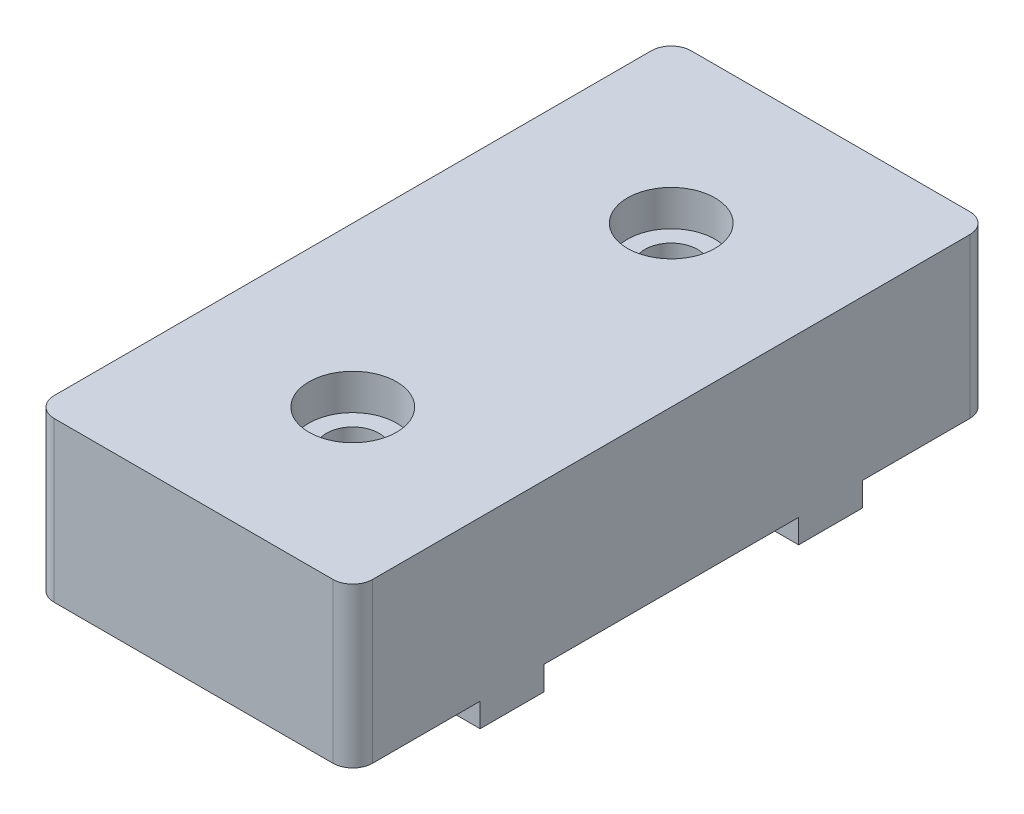
ISO-10303-21;
HEADER;
FILE_DESCRIPTION(('STEP AP214'),'2;1');
FILE_NAME('part.step','',(''),(''),'','','');
FILE_SCHEMA(('AUTOMOTIVE_DESIGN { 1 0 10303 214 1 1 1 1 }'));
ENDSEC;
DATA;
#1=APPLICATION_CONTEXT('core data for automotive mechanical design processes');
#2=APPLICATION_PROTOCOL_DEFINITION('international standard','automotive_design',2000,#1);
#3=PRODUCT_CONTEXT('',#1,'mechanical');
#4=PRODUCT('Part','Part','',(#3));
#5=PRODUCT_RELATED_PRODUCT_CATEGORY('part','',(#4));
#6=PRODUCT_DEFINITION_FORMATION('','',#4);
#7=PRODUCT_DEFINITION_CONTEXT('part definition',#1,'design');
#8=PRODUCT_DEFINITION('design','',#6,#7);
#9=PRODUCT_DEFINITION_SHAPE('','',#8);
#10=(LENGTH_UNIT() NAMED_UNIT(*) SI_UNIT(.MILLI.,.METRE.));
#11=(NAMED_UNIT(*) PLANE_ANGLE_UNIT() SI_UNIT($,.RADIAN.));
#12=(NAMED_UNIT(*) SI_UNIT($,.STERADIAN.) SOLID_ANGLE_UNIT());
#13=UNCERTAINTY_MEASURE_WITH_UNIT(LENGTH_MEASURE(1.E-05),#10,'distance_accuracy_value','');
#14=(GEOMETRIC_REPRESENTATION_CONTEXT(3) GLOBAL_UNCERTAINTY_ASSIGNED_CONTEXT((#13)) GLOBAL_UNIT_ASSIGNED_CONTEXT((#10,
#11,#12)) REPRESENTATION_CONTEXT('',''));
#15=CARTESIAN_POINT('',(0.,0.,0.));
#16=DIRECTION('',(0.,0.,1.));
#17=DIRECTION('',(1.,0.,0.));
#18=AXIS2_PLACEMENT_3D('',#15,#16,#17);
#19=CARTESIAN_POINT('',(0.,0.,0.));
#20=DIRECTION('',(0.,1.,0.));
#21=DIRECTION('',(0.,0.,1.));
#22=AXIS2_PLACEMENT_3D('',#19,#20,#21);
#23=PLANE('',#22);
#24=DIRECTION('',(0.,0.,1.));
#25=VECTOR('',#24,1.);
#26=CARTESIAN_POINT('',(-20.,0.,40.));
#27=LINE('',#26,#25);
#28=CARTESIAN_POINT('',(-20.,0.,-16.));
#29=VERTEX_POINT('',#28);
#30=CARTESIAN_POINT('',(-20.,0.,16.));
#31=VERTEX_POINT('',#30);
#32=EDGE_CURVE('E245',#29,#31,#27,.T.);
#33=ORIENTED_EDGE('',*,*,#32,.F.);
#34=DIRECTION('',(1.,0.,0.));
#35=VECTOR('',#34,1.);
#36=CARTESIAN_POINT('',(20.,0.,-16.));
#37=LINE('',#36,#35);
#38=CARTESIAN_POINT('',(20.,0.,-16.));
#39=VERTEX_POINT('',#38);
#40=EDGE_CURVE('E183',#29,#39,#37,.T.);
#41=ORIENTED_EDGE('',*,*,#40,.T.);
#42=DIRECTION('',(0.,0.,-1.));
#43=VECTOR('',#42,1.);
#44=CARTESIAN_POINT('',(20.,0.,40.));
#45=LINE('',#44,#43);
#46=CARTESIAN_POINT('',(20.,0.,16.));
#47=VERTEX_POINT('',#46);
#48=EDGE_CURVE('E250',#47,#39,#45,.T.);
#49=ORIENTED_EDGE('',*,*,#48,.F.);
#50=DIRECTION('',(-1.,0.,0.));
#51=VECTOR('',#50,1.);
#52=CARTESIAN_POINT('',(-20.,0.,16.));
#53=LINE('',#52,#51);
#54=EDGE_CURVE('E204',#47,#31,#53,.T.);
#55=ORIENTED_EDGE('',*,*,#54,.T.);
#56=EDGE_LOOP('',(#33,#41,#49,#55));
#57=FACE_BOUND('',#56,.T.);
#58=ADVANCED_FACE('F44',(#57),#23,.F.);
#59=DIRECTION('',(1.,0.,0.));
#60=VECTOR('',#59,1.);
#61=CARTESIAN_POINT('',(20.,0.,40.));
#62=LINE('',#61,#60);
#63=CARTESIAN_POINT('',(-17.5,0.,40.));
#64=VERTEX_POINT('',#63);
#65=CARTESIAN_POINT('',(17.5,0.,40.));
#66=VERTEX_POINT('',#65);
#67=EDGE_CURVE('E244',#64,#66,#62,.T.);
#68=ORIENTED_EDGE('',*,*,#67,.F.);
#69=CARTESIAN_POINT('',(-17.5,0.,37.5));
#70=DIRECTION('',(0.,1.,0.));
#71=DIRECTION('',(0.,0.,1.));
#72=AXIS2_PLACEMENT_3D('',#69,#70,#71);
#73=CIRCLE('',#72,2.5);
#74=CARTESIAN_POINT('',(-20.,0.,37.5));
#75=VERTEX_POINT('',#74);
#76=EDGE_CURVE('E11',#64,#75,#73,.F.);
#77=ORIENTED_EDGE('',*,*,#76,.T.);
#78=CARTESIAN_POINT('',(-20.,0.,24.));
#79=VERTEX_POINT('',#78);
#80=EDGE_CURVE('E221',#79,#75,#27,.T.);
#81=ORIENTED_EDGE('',*,*,#80,.F.);
#82=DIRECTION('',(1.,0.,0.));
#83=VECTOR('',#82,1.);
#84=CARTESIAN_POINT('',(-20.,0.,24.));
#85=LINE('',#84,#83);
#86=CARTESIAN_POINT('',(20.,0.,24.));
#87=VERTEX_POINT('',#86);
#88=EDGE_CURVE('E196',#79,#87,#85,.T.);
#89=ORIENTED_EDGE('',*,*,#88,.T.);
#90=CARTESIAN_POINT('',(20.,0.,37.5));
#91=VERTEX_POINT('',#90);
#92=EDGE_CURVE('E248',#91,#87,#45,.T.);
#93=ORIENTED_EDGE('',*,*,#92,.F.);
#94=CARTESIAN_POINT('',(17.5,0.,37.5));
#95=DIRECTION('',(0.,1.,0.));
#96=DIRECTION('',(0.,0.,1.));
#97=AXIS2_PLACEMENT_3D('',#94,#95,#96);
#98=CIRCLE('',#97,2.5);
#99=EDGE_CURVE('E52',#91,#66,#98,.F.);
#100=ORIENTED_EDGE('',*,*,#99,.T.);
#101=EDGE_LOOP('',(#68,#77,#81,#89,#93,#100));
#102=FACE_BOUND('',#101,.T.);
#103=ADVANCED_FACE('F294',(#102),#23,.F.);
#104=CARTESIAN_POINT('',(-20.,20.,40.));
#105=DIRECTION('',(1.,0.,0.));
#106=DIRECTION('',(0.,0.,-1.));
#107=AXIS2_PLACEMENT_3D('',#104,#105,#106);
#108=PLANE('',#107);
#109=CARTESIAN_POINT('',(-20.,10.,0.));
#110=DIRECTION('',(-1.,0.,0.));
#111=DIRECTION('',(0.,0.,1.));
#112=AXIS2_PLACEMENT_3D('',#109,#110,#111);
#113=CIRCLE('',#112,3.39999999999999);
#114=CARTESIAN_POINT('',(-20.,10.,3.39999999999999));
#115=VERTEX_POINT('',#114);
#116=EDGE_CURVE('E419',#115,#115,#113,.T.);
#117=ORIENTED_EDGE('',*,*,#116,.F.);
#118=EDGE_LOOP('',(#117));
#119=FACE_BOUND('',#118,.T.);
#120=DIRECTION('',(0.,0.,1.));
#121=VECTOR('',#120,1.);
#122=CARTESIAN_POINT('',(-20.,20.,40.));
#123=LINE('',#122,#121);
#124=CARTESIAN_POINT('',(-20.,20.,-37.5));
#125=VERTEX_POINT('',#124);
#126=CARTESIAN_POINT('',(-20.,20.,37.5));
#127=VERTEX_POINT('',#126);
#128=EDGE_CURVE('E228',#125,#127,#123,.T.);
#129=ORIENTED_EDGE('',*,*,#128,.F.);
#130=DIRECTION('',(0.,-1.,0.));
#131=VECTOR('',#130,1.);
#132=CARTESIAN_POINT('',(-20.,20.,-37.5));
#133=LINE('',#132,#131);
#134=CARTESIAN_POINT('',(-20.,0.,-37.5));
#135=VERTEX_POINT('',#134);
#136=EDGE_CURVE('E283',#125,#135,#133,.T.);
#137=ORIENTED_EDGE('',*,*,#136,.T.);
#138=CARTESIAN_POINT('',(-20.,0.,-24.));
#139=VERTEX_POINT('',#138);
#140=EDGE_CURVE('E242',#135,#139,#27,.T.);
#141=ORIENTED_EDGE('',*,*,#140,.T.);
#142=DIRECTION('',(0.,1.,0.));
#143=VECTOR('',#142,1.);
#144=CARTESIAN_POINT('',(-20.,-3.,-24.));
#145=LINE('',#144,#143);
#146=CARTESIAN_POINT('',(-20.,-3.,-24.));
#147=VERTEX_POINT('',#146);
#148=EDGE_CURVE('E167',#147,#139,#145,.T.);
#149=ORIENTED_EDGE('',*,*,#148,.F.);
#150=DIRECTION('',(0.,0.,1.));
#151=VECTOR('',#150,1.);
#152=CARTESIAN_POINT('',(-20.,-3.,-24.));
#153=LINE('',#152,#151);
#154=CARTESIAN_POINT('',(-20.,-3.,-16.));
#155=VERTEX_POINT('',#154);
#156=EDGE_CURVE('E178',#147,#155,#153,.T.);
#157=ORIENTED_EDGE('',*,*,#156,.T.);
#158=DIRECTION('',(0.,1.,0.));
#159=VECTOR('',#158,1.);
#160=CARTESIAN_POINT('',(-20.,-3.,-16.));
#161=LINE('',#160,#159);
#162=EDGE_CURVE('E197',#155,#29,#161,.T.);
#163=ORIENTED_EDGE('',*,*,#162,.T.);
#164=ORIENTED_EDGE('',*,*,#32,.T.);
#165=DIRECTION('',(0.,1.,0.));
#166=VECTOR('',#165,1.);
#167=CARTESIAN_POINT('',(-20.,-3.,16.));
#168=LINE('',#167,#166);
#169=CARTESIAN_POINT('',(-20.,-3.,16.));
#170=VERTEX_POINT('',#169);
#171=EDGE_CURVE('E218',#170,#31,#168,.T.);
#172=ORIENTED_EDGE('',*,*,#171,.F.);
#173=DIRECTION('',(0.,0.,1.));
#174=VECTOR('',#173,1.);
#175=CARTESIAN_POINT('',(-20.,-3.,24.));
#176=LINE('',#175,#174);
#177=CARTESIAN_POINT('',(-20.,-3.,24.));
#178=VERTEX_POINT('',#177);
#179=EDGE_CURVE('E200',#170,#178,#176,.T.);
#180=ORIENTED_EDGE('',*,*,#179,.T.);
#181=DIRECTION('',(0.,1.,0.));
#182=VECTOR('',#181,1.);
#183=CARTESIAN_POINT('',(-20.,-3.,24.));
#184=LINE('',#183,#182);
#185=EDGE_CURVE('E213',#178,#79,#184,.T.);
#186=ORIENTED_EDGE('',*,*,#185,.T.);
#187=ORIENTED_EDGE('',*,*,#80,.T.);
#188=DIRECTION('',(0.,-1.,0.));
#189=VECTOR('',#188,1.);
#190=CARTESIAN_POINT('',(-20.,20.,37.5));
#191=LINE('',#190,#189);
#192=EDGE_CURVE('E281',#75,#127,#191,.F.);
#193=ORIENTED_EDGE('',*,*,#192,.T.);
#194=EDGE_LOOP('',(#129,#137,#141,#149,#157,#163,#164,#172,#180,#186,#187,#193));
#195=FACE_BOUND('',#194,.T.);
#196=ADVANCED_FACE('F299',(#119,#195),#108,.F.);
#197=CARTESIAN_POINT('',(20.,20.,40.));
#198=DIRECTION('',(0.,0.,-1.));
#199=DIRECTION('',(-1.,0.,0.));
#200=AXIS2_PLACEMENT_3D('',#197,#198,#199);
#201=PLANE('',#200);
#202=DIRECTION('',(1.,0.,0.));
#203=VECTOR('',#202,1.);
#204=CARTESIAN_POINT('',(20.,20.,40.));
#205=LINE('',#204,#203);
#206=CARTESIAN_POINT('',(-17.5,20.,40.));
#207=VERTEX_POINT('',#206);
#208=CARTESIAN_POINT('',(17.5,20.,40.));
#209=VERTEX_POINT('',#208);
#210=EDGE_CURVE('E231',#207,#209,#205,.T.);
#211=ORIENTED_EDGE('',*,*,#210,.F.);
#212=DIRECTION('',(0.,-1.,0.));
#213=VECTOR('',#212,1.);
#214=CARTESIAN_POINT('',(-17.5,20.,40.));
#215=LINE('',#214,#213);
#216=EDGE_CURVE('E288',#207,#64,#215,.T.);
#217=ORIENTED_EDGE('',*,*,#216,.T.);
#218=ORIENTED_EDGE('',*,*,#67,.T.);
#219=DIRECTION('',(0.,-1.,0.));
#220=VECTOR('',#219,1.);
#221=CARTESIAN_POINT('',(17.5,20.,40.));
#222=LINE('',#221,#220);
#223=EDGE_CURVE('E286',#66,#209,#222,.F.);
#224=ORIENTED_EDGE('',*,*,#223,.T.);
#225=EDGE_LOOP('',(#211,#217,#218,#224));
#226=FACE_BOUND('',#225,.T.);
#227=ADVANCED_FACE('F291',(#226),#201,.F.);
#228=CARTESIAN_POINT('',(20.,20.,40.));
#229=DIRECTION('',(-1.,0.,0.));
#230=DIRECTION('',(0.,0.,1.));
#231=AXIS2_PLACEMENT_3D('',#228,#229,#230);
#232=PLANE('',#231);
#233=CARTESIAN_POINT('',(20.,0.,-24.));
#234=VERTEX_POINT('',#233);
#235=CARTESIAN_POINT('',(20.,0.,-37.5));
#236=VERTEX_POINT('',#235);
#237=EDGE_CURVE('E247',#234,#236,#45,.T.);
#238=ORIENTED_EDGE('',*,*,#237,.T.);
#239=DIRECTION('',(0.,-1.,0.));
#240=VECTOR('',#239,1.);
#241=CARTESIAN_POINT('',(20.,20.,-37.5));
#242=LINE('',#241,#240);
#243=CARTESIAN_POINT('',(20.,20.,-37.5));
#244=VERTEX_POINT('',#243);
#245=EDGE_CURVE('E271',#236,#244,#242,.F.);
#246=ORIENTED_EDGE('',*,*,#245,.T.);
#247=DIRECTION('',(0.,0.,-1.));
#248=VECTOR('',#247,1.);
#249=CARTESIAN_POINT('',(20.,20.,40.));
#250=LINE('',#249,#248);
#251=CARTESIAN_POINT('',(20.,20.,37.5));
#252=VERTEX_POINT('',#251);
#253=EDGE_CURVE('E235',#252,#244,#250,.T.);
#254=ORIENTED_EDGE('',*,*,#253,.F.);
#255=DIRECTION('',(0.,-1.,0.));
#256=VECTOR('',#255,1.);
#257=CARTESIAN_POINT('',(20.,20.,37.5));
#258=LINE('',#257,#256);
#259=EDGE_CURVE('E268',#252,#91,#258,.T.);
#260=ORIENTED_EDGE('',*,*,#259,.T.);
#261=ORIENTED_EDGE('',*,*,#92,.T.);
#262=DIRECTION('',(0.,1.,0.));
#263=VECTOR('',#262,1.);
#264=CARTESIAN_POINT('',(20.,-3.,24.));
#265=LINE('',#264,#263);
#266=CARTESIAN_POINT('',(20.,-3.,24.));
#267=VERTEX_POINT('',#266);
#268=EDGE_CURVE('E224',#267,#87,#265,.T.);
#269=ORIENTED_EDGE('',*,*,#268,.F.);
#270=DIRECTION('',(0.,0.,-1.));
#271=VECTOR('',#270,1.);
#272=CARTESIAN_POINT('',(20.,-3.,24.));
#273=LINE('',#272,#271);
#274=CARTESIAN_POINT('',(20.,-3.,16.));
#275=VERTEX_POINT('',#274);
#276=EDGE_CURVE('E207',#267,#275,#273,.T.);
#277=ORIENTED_EDGE('',*,*,#276,.T.);
#278=DIRECTION('',(0.,1.,0.));
#279=VECTOR('',#278,1.);
#280=CARTESIAN_POINT('',(20.,-3.,16.));
#281=LINE('',#280,#279);
#282=EDGE_CURVE('E222',#275,#47,#281,.T.);
#283=ORIENTED_EDGE('',*,*,#282,.T.);
#284=ORIENTED_EDGE('',*,*,#48,.T.);
#285=DIRECTION('',(0.,1.,0.));
#286=VECTOR('',#285,1.);
#287=CARTESIAN_POINT('',(20.,-3.,-16.));
#288=LINE('',#287,#286);
#289=CARTESIAN_POINT('',(20.,-3.,-16.));
#290=VERTEX_POINT('',#289);
#291=EDGE_CURVE('E182',#290,#39,#288,.T.);
#292=ORIENTED_EDGE('',*,*,#291,.F.);
#293=DIRECTION('',(0.,0.,-1.));
#294=VECTOR('',#293,1.);
#295=CARTESIAN_POINT('',(20.,-3.,-24.));
#296=LINE('',#295,#294);
#297=CARTESIAN_POINT('',(20.,-3.,-24.));
#298=VERTEX_POINT('',#297);
#299=EDGE_CURVE('E175',#290,#298,#296,.T.);
#300=ORIENTED_EDGE('',*,*,#299,.T.);
#301=DIRECTION('',(0.,1.,0.));
#302=VECTOR('',#301,1.);
#303=CARTESIAN_POINT('',(20.,-3.,-24.));
#304=LINE('',#303,#302);
#305=EDGE_CURVE('E156',#298,#234,#304,.T.);
#306=ORIENTED_EDGE('',*,*,#305,.T.);
#307=EDGE_LOOP('',(#238,#246,#254,#260,#261,#269,#277,#283,#284,#292,#300,#306));
#308=FACE_BOUND('',#307,.T.);
#309=ADVANCED_FACE('F180',(#308),#232,.F.);
#310=CARTESIAN_POINT('',(20.,20.,-40.));
#311=DIRECTION('',(0.,0.,1.));
#312=DIRECTION('',(1.,0.,0.));
#313=AXIS2_PLACEMENT_3D('',#310,#311,#312);
#314=PLANE('',#313);
#315=DIRECTION('',(-1.,0.,0.));
#316=VECTOR('',#315,1.);
#317=CARTESIAN_POINT('',(20.,20.,-40.));
#318=LINE('',#317,#316);
#319=CARTESIAN_POINT('',(17.5,20.,-40.));
#320=VERTEX_POINT('',#319);
#321=CARTESIAN_POINT('',(-17.5,20.,-40.));
#322=VERTEX_POINT('',#321);
#323=EDGE_CURVE('E238',#320,#322,#318,.T.);
#324=ORIENTED_EDGE('',*,*,#323,.F.);
#325=DIRECTION('',(0.,-1.,0.));
#326=VECTOR('',#325,1.);
#327=CARTESIAN_POINT('',(17.5,20.,-40.));
#328=LINE('',#327,#326);
#329=CARTESIAN_POINT('',(17.5,0.,-40.));
#330=VERTEX_POINT('',#329);
#331=EDGE_CURVE('E261',#320,#330,#328,.T.);
#332=ORIENTED_EDGE('',*,*,#331,.T.);
#333=DIRECTION('',(-1.,0.,0.));
#334=VECTOR('',#333,1.);
#335=CARTESIAN_POINT('',(20.,0.,-40.));
#336=LINE('',#335,#334);
#337=CARTESIAN_POINT('',(-17.5,0.,-40.));
#338=VERTEX_POINT('',#337);
#339=EDGE_CURVE('E232',#330,#338,#336,.T.);
#340=ORIENTED_EDGE('',*,*,#339,.T.);
#341=DIRECTION('',(0.,-1.,0.));
#342=VECTOR('',#341,1.);
#343=CARTESIAN_POINT('',(-17.5,20.,-40.));
#344=LINE('',#343,#342);
#345=EDGE_CURVE('E241',#338,#322,#344,.F.);
#346=ORIENTED_EDGE('',*,*,#345,.T.);
#347=EDGE_LOOP('',(#324,#332,#340,#346));
#348=FACE_BOUND('',#347,.T.);
#349=ADVANCED_FACE('F316',(#348),#314,.F.);
#350=CARTESIAN_POINT('',(0.,20.,0.));
#351=DIRECTION('',(0.,1.,0.));
#352=DIRECTION('',(0.,0.,1.));
#353=AXIS2_PLACEMENT_3D('',#350,#351,#352);
#354=PLANE('',#353);
#355=CARTESIAN_POINT('',(0.,20.,20.));
#356=DIRECTION('',(0.,1.,0.));
#357=DIRECTION('',(0.,0.,1.));
#358=AXIS2_PLACEMENT_3D('',#355,#356,#357);
#359=CIRCLE('',#358,5.5);
#360=CARTESIAN_POINT('',(0.,20.,25.5));
#361=VERTEX_POINT('',#360);
#362=EDGE_CURVE('E422',#361,#361,#359,.T.);
#363=ORIENTED_EDGE('',*,*,#362,.F.);
#364=EDGE_LOOP('',(#363));
#365=FACE_BOUND('',#364,.T.);
#366=CARTESIAN_POINT('',(0.,20.,-20.));
#367=DIRECTION('',(0.,1.,0.));
#368=DIRECTION('',(0.,0.,1.));
#369=AXIS2_PLACEMENT_3D('',#366,#367,#368);
#370=CIRCLE('',#369,5.5);
#371=CARTESIAN_POINT('',(0.,20.,-14.5));
#372=VERTEX_POINT('',#371);
#373=EDGE_CURVE('E258',#372,#372,#370,.T.);
#374=ORIENTED_EDGE('',*,*,#373,.F.);
#375=EDGE_LOOP('',(#374));
#376=FACE_BOUND('',#375,.T.);
#377=ORIENTED_EDGE('',*,*,#253,.T.);
#378=CARTESIAN_POINT('',(17.5,20.,-37.5));
#379=DIRECTION('',(0.,1.,0.));
#380=DIRECTION('',(0.,0.,1.));
#381=AXIS2_PLACEMENT_3D('',#378,#379,#380);
#382=CIRCLE('',#381,2.5);
#383=EDGE_CURVE('E279',#244,#320,#382,.T.);
#384=ORIENTED_EDGE('',*,*,#383,.T.);
#385=ORIENTED_EDGE('',*,*,#323,.T.);
#386=CARTESIAN_POINT('',(-17.5,20.,-37.5));
#387=DIRECTION('',(0.,1.,0.));
#388=DIRECTION('',(0.,0.,1.));
#389=AXIS2_PLACEMENT_3D('',#386,#387,#388);
#390=CIRCLE('',#389,2.5);
#391=EDGE_CURVE('E277',#322,#125,#390,.T.);
#392=ORIENTED_EDGE('',*,*,#391,.T.);
#393=ORIENTED_EDGE('',*,*,#128,.T.);
#394=CARTESIAN_POINT('',(-17.5,20.,37.5));
#395=DIRECTION('',(0.,1.,0.));
#396=DIRECTION('',(0.,0.,1.));
#397=AXIS2_PLACEMENT_3D('',#394,#395,#396);
#398=CIRCLE('',#397,2.5);
#399=EDGE_CURVE('E275',#127,#207,#398,.T.);
#400=ORIENTED_EDGE('',*,*,#399,.T.);
#401=ORIENTED_EDGE('',*,*,#210,.T.);
#402=CARTESIAN_POINT('',(17.5,20.,37.5));
#403=DIRECTION('',(0.,1.,0.));
#404=DIRECTION('',(0.,0.,1.));
#405=AXIS2_PLACEMENT_3D('',#402,#403,#404);
#406=CIRCLE('',#405,2.5);
#407=EDGE_CURVE('E273',#209,#252,#406,.T.);
#408=ORIENTED_EDGE('',*,*,#407,.T.);
#409=EDGE_LOOP('',(#377,#384,#385,#392,#393,#400,#401,#408));
#410=FACE_BOUND('',#409,.T.);
#411=ADVANCED_FACE('F303',(#365,#376,#410),#354,.T.);
#412=ORIENTED_EDGE('',*,*,#339,.F.);
#413=CARTESIAN_POINT('',(17.5,0.,-37.5));
#414=DIRECTION('',(0.,1.,0.));
#415=DIRECTION('',(0.,0.,1.));
#416=AXIS2_PLACEMENT_3D('',#413,#414,#415);
#417=CIRCLE('',#416,2.5);
#418=EDGE_CURVE('E266',#330,#236,#417,.F.);
#419=ORIENTED_EDGE('',*,*,#418,.T.);
#420=ORIENTED_EDGE('',*,*,#237,.F.);
#421=DIRECTION('',(-1.,0.,0.));
#422=VECTOR('',#421,1.);
#423=CARTESIAN_POINT('',(20.,0.,-24.));
#424=LINE('',#423,#422);
#425=EDGE_CURVE('E162',#234,#139,#424,.T.);
#426=ORIENTED_EDGE('',*,*,#425,.T.);
#427=ORIENTED_EDGE('',*,*,#140,.F.);
#428=CARTESIAN_POINT('',(-17.5,0.,-37.5));
#429=DIRECTION('',(0.,1.,0.));
#430=DIRECTION('',(0.,0.,1.));
#431=AXIS2_PLACEMENT_3D('',#428,#429,#430);
#432=CIRCLE('',#431,2.5);
#433=EDGE_CURVE('E264',#135,#338,#432,.F.);
#434=ORIENTED_EDGE('',*,*,#433,.T.);
#435=EDGE_LOOP('',(#412,#419,#420,#426,#427,#434));
#436=FACE_BOUND('',#435,.T.);
#437=ADVANCED_FACE('F313',(#436),#23,.F.);
#438=CARTESIAN_POINT('',(-20.,-3.,16.));
#439=DIRECTION('',(0.,0.,-1.));
#440=DIRECTION('',(-1.,0.,0.));
#441=AXIS2_PLACEMENT_3D('',#438,#439,#440);
#442=PLANE('',#441);
#443=ORIENTED_EDGE('',*,*,#54,.F.);
#444=ORIENTED_EDGE('',*,*,#282,.F.);
#445=DIRECTION('',(-1.,0.,0.));
#446=VECTOR('',#445,1.);
#447=CARTESIAN_POINT('',(-20.,-3.,16.));
#448=LINE('',#447,#446);
#449=EDGE_CURVE('E210',#275,#170,#448,.T.);
#450=ORIENTED_EDGE('',*,*,#449,.T.);
#451=ORIENTED_EDGE('',*,*,#171,.T.);
#452=EDGE_LOOP('',(#443,#444,#450,#451));
#453=FACE_BOUND('',#452,.T.);
#454=ADVANCED_FACE('F332',(#453),#442,.T.);
#455=CARTESIAN_POINT('',(-20.,-3.,24.));
#456=DIRECTION('',(0.,0.,1.));
#457=DIRECTION('',(1.,0.,0.));
#458=AXIS2_PLACEMENT_3D('',#455,#456,#457);
#459=PLANE('',#458);
#460=ORIENTED_EDGE('',*,*,#88,.F.);
#461=ORIENTED_EDGE('',*,*,#185,.F.);
#462=DIRECTION('',(1.,0.,0.));
#463=VECTOR('',#462,1.);
#464=CARTESIAN_POINT('',(-20.,-3.,24.));
#465=LINE('',#464,#463);
#466=EDGE_CURVE('E203',#178,#267,#465,.T.);
#467=ORIENTED_EDGE('',*,*,#466,.T.);
#468=ORIENTED_EDGE('',*,*,#268,.T.);
#469=EDGE_LOOP('',(#460,#461,#467,#468));
#470=FACE_BOUND('',#469,.T.);
#471=ADVANCED_FACE('F339',(#470),#459,.T.);
#472=CARTESIAN_POINT('',(0.,-3.,0.));
#473=DIRECTION('',(0.,-1.,0.));
#474=DIRECTION('',(0.,0.,-1.));
#475=AXIS2_PLACEMENT_3D('',#472,#473,#474);
#476=PLANE('',#475);
#477=CARTESIAN_POINT('',(0.,-3.,20.));
#478=DIRECTION('',(0.,-1.,0.));
#479=DIRECTION('',(0.,0.,-1.));
#480=AXIS2_PLACEMENT_3D('',#477,#478,#479);
#481=CIRCLE('',#480,3.3);
#482=CARTESIAN_POINT('',(0.,-3.,16.7));
#483=VERTEX_POINT('',#482);
#484=EDGE_CURVE('E255',#483,#483,#481,.T.);
#485=ORIENTED_EDGE('',*,*,#484,.F.);
#486=EDGE_LOOP('',(#485));
#487=FACE_BOUND('',#486,.T.);
#488=ORIENTED_EDGE('',*,*,#179,.F.);
#489=ORIENTED_EDGE('',*,*,#449,.F.);
#490=ORIENTED_EDGE('',*,*,#276,.F.);
#491=ORIENTED_EDGE('',*,*,#466,.F.);
#492=EDGE_LOOP('',(#488,#489,#490,#491));
#493=FACE_BOUND('',#492,.T.);
#494=ADVANCED_FACE('F336',(#487,#493),#476,.T.);
#495=CARTESIAN_POINT('',(20.,-3.,-16.));
#496=DIRECTION('',(0.,0.,1.));
#497=DIRECTION('',(1.,0.,0.));
#498=AXIS2_PLACEMENT_3D('',#495,#496,#497);
#499=PLANE('',#498);
#500=ORIENTED_EDGE('',*,*,#40,.F.);
#501=ORIENTED_EDGE('',*,*,#162,.F.);
#502=DIRECTION('',(1.,0.,0.));
#503=VECTOR('',#502,1.);
#504=CARTESIAN_POINT('',(20.,-3.,-16.));
#505=LINE('',#504,#503);
#506=EDGE_CURVE('E168',#155,#290,#505,.T.);
#507=ORIENTED_EDGE('',*,*,#506,.T.);
#508=ORIENTED_EDGE('',*,*,#291,.T.);
#509=EDGE_LOOP('',(#500,#501,#507,#508));
#510=FACE_BOUND('',#509,.T.);
#511=ADVANCED_FACE('F329',(#510),#499,.T.);
#512=CARTESIAN_POINT('',(20.,-3.,-24.));
#513=DIRECTION('',(0.,0.,-1.));
#514=DIRECTION('',(-1.,0.,0.));
#515=AXIS2_PLACEMENT_3D('',#512,#513,#514);
#516=PLANE('',#515);
#517=ORIENTED_EDGE('',*,*,#425,.F.);
#518=ORIENTED_EDGE('',*,*,#305,.F.);
#519=DIRECTION('',(-1.,0.,0.));
#520=VECTOR('',#519,1.);
#521=CARTESIAN_POINT('',(20.,-3.,-24.));
#522=LINE('',#521,#520);
#523=EDGE_CURVE('E160',#298,#147,#522,.T.);
#524=ORIENTED_EDGE('',*,*,#523,.T.);
#525=ORIENTED_EDGE('',*,*,#148,.T.);
#526=EDGE_LOOP('',(#517,#518,#524,#525));
#527=FACE_BOUND('',#526,.T.);
#528=ADVANCED_FACE('F158',(#527),#516,.T.);
#529=CARTESIAN_POINT('',(0.,-3.,0.));
#530=DIRECTION('',(0.,-1.,0.));
#531=DIRECTION('',(0.,0.,-1.));
#532=AXIS2_PLACEMENT_3D('',#529,#530,#531);
#533=PLANE('',#532);
#534=CARTESIAN_POINT('',(0.,-3.,-20.));
#535=DIRECTION('',(0.,-1.,0.));
#536=DIRECTION('',(0.,0.,-1.));
#537=AXIS2_PLACEMENT_3D('',#534,#535,#536);
#538=CIRCLE('',#537,3.3);
#539=CARTESIAN_POINT('',(0.,-3.,-23.3));
#540=VERTEX_POINT('',#539);
#541=EDGE_CURVE('E193',#540,#540,#538,.T.);
#542=ORIENTED_EDGE('',*,*,#541,.F.);
#543=EDGE_LOOP('',(#542));
#544=FACE_BOUND('',#543,.T.);
#545=ORIENTED_EDGE('',*,*,#299,.F.);
#546=ORIENTED_EDGE('',*,*,#506,.F.);
#547=ORIENTED_EDGE('',*,*,#156,.F.);
#548=ORIENTED_EDGE('',*,*,#523,.F.);
#549=EDGE_LOOP('',(#545,#546,#547,#548));
#550=FACE_BOUND('',#549,.T.);
#551=ADVANCED_FACE('F173',(#544,#550),#533,.T.);
#552=CARTESIAN_POINT('',(0.,20.,-20.));
#553=DIRECTION('',(0.,1.,0.));
#554=DIRECTION('',(0.,0.,1.));
#555=AXIS2_PLACEMENT_3D('',#552,#553,#554);
#556=CYLINDRICAL_SURFACE('',#555,3.3);
#557=ORIENTED_EDGE('',*,*,#541,.T.);
#558=EDGE_LOOP('',(#557));
#559=FACE_BOUND('',#558,.T.);
#560=CARTESIAN_POINT('',(0.,15.5,-20.));
#561=DIRECTION('',(0.,1.,0.));
#562=DIRECTION('',(0.,0.,1.));
#563=AXIS2_PLACEMENT_3D('',#560,#561,#562);
#564=CIRCLE('',#563,3.3);
#565=CARTESIAN_POINT('',(0.,15.5,-16.7));
#566=VERTEX_POINT('',#565);
#567=EDGE_CURVE('E188',#566,#566,#564,.T.);
#568=ORIENTED_EDGE('',*,*,#567,.T.);
#569=EDGE_LOOP('',(#568));
#570=FACE_BOUND('',#569,.T.);
#571=ADVANCED_FACE('F377',(#559,#570),#556,.F.);
#572=CARTESIAN_POINT('',(3.3,15.5,-20.));
#573=DIRECTION('',(0.,-1.,0.));
#574=DIRECTION('',(0.,0.,-1.));
#575=AXIS2_PLACEMENT_3D('',#572,#573,#574);
#576=PLANE('',#575);
#577=ORIENTED_EDGE('',*,*,#567,.F.);
#578=EDGE_LOOP('',(#577));
#579=FACE_BOUND('',#578,.T.);
#580=CARTESIAN_POINT('',(0.,15.5,-20.));
#581=DIRECTION('',(0.,1.,0.));
#582=DIRECTION('',(0.,0.,1.));
#583=AXIS2_PLACEMENT_3D('',#580,#581,#582);
#584=CIRCLE('',#583,5.5);
#585=CARTESIAN_POINT('',(0.,15.5,-14.5));
#586=VERTEX_POINT('',#585);
#587=EDGE_CURVE('E433',#586,#586,#584,.T.);
#588=ORIENTED_EDGE('',*,*,#587,.T.);
#589=EDGE_LOOP('',(#588));
#590=FACE_BOUND('',#589,.T.);
#591=ADVANCED_FACE('F381',(#579,#590),#576,.F.);
#592=CARTESIAN_POINT('',(0.,20.,-20.));
#593=DIRECTION('',(0.,1.,0.));
#594=DIRECTION('',(0.,0.,1.));
#595=AXIS2_PLACEMENT_3D('',#592,#593,#594);
#596=CYLINDRICAL_SURFACE('',#595,5.5);
#597=ORIENTED_EDGE('',*,*,#587,.F.);
#598=EDGE_LOOP('',(#597));
#599=FACE_BOUND('',#598,.T.);
#600=ORIENTED_EDGE('',*,*,#373,.T.);
#601=EDGE_LOOP('',(#600));
#602=FACE_BOUND('',#601,.T.);
#603=ADVANCED_FACE('F385',(#599,#602),#596,.F.);
#604=CARTESIAN_POINT('',(0.,20.,20.));
#605=DIRECTION('',(0.,1.,0.));
#606=DIRECTION('',(0.,0.,1.));
#607=AXIS2_PLACEMENT_3D('',#604,#605,#606);
#608=CYLINDRICAL_SURFACE('',#607,3.3);
#609=ORIENTED_EDGE('',*,*,#484,.T.);
#610=EDGE_LOOP('',(#609));
#611=FACE_BOUND('',#610,.T.);
#612=CARTESIAN_POINT('',(0.,15.5,20.));
#613=DIRECTION('',(0.,1.,0.));
#614=DIRECTION('',(0.,0.,1.));
#615=AXIS2_PLACEMENT_3D('',#612,#613,#614);
#616=CIRCLE('',#615,3.3);
#617=CARTESIAN_POINT('',(0.,15.5,23.3));
#618=VERTEX_POINT('',#617);
#619=EDGE_CURVE('E259',#618,#618,#616,.T.);
#620=ORIENTED_EDGE('',*,*,#619,.T.);
#621=EDGE_LOOP('',(#620));
#622=FACE_BOUND('',#621,.T.);
#623=ADVANCED_FACE('F389',(#611,#622),#608,.F.);
#624=CARTESIAN_POINT('',(3.3,15.5,20.));
#625=DIRECTION('',(0.,-1.,0.));
#626=DIRECTION('',(0.,0.,-1.));
#627=AXIS2_PLACEMENT_3D('',#624,#625,#626);
#628=PLANE('',#627);
#629=ORIENTED_EDGE('',*,*,#619,.F.);
#630=EDGE_LOOP('',(#629));
#631=FACE_BOUND('',#630,.T.);
#632=CARTESIAN_POINT('',(0.,15.5,20.));
#633=DIRECTION('',(0.,1.,0.));
#634=DIRECTION('',(0.,0.,1.));
#635=AXIS2_PLACEMENT_3D('',#632,#633,#634);
#636=CIRCLE('',#635,5.5);
#637=CARTESIAN_POINT('',(0.,15.5,25.5));
#638=VERTEX_POINT('',#637);
#639=EDGE_CURVE('E427',#638,#638,#636,.T.);
#640=ORIENTED_EDGE('',*,*,#639,.T.);
#641=EDGE_LOOP('',(#640));
#642=FACE_BOUND('',#641,.T.);
#643=ADVANCED_FACE('F393',(#631,#642),#628,.F.);
#644=CARTESIAN_POINT('',(0.,20.,20.));
#645=DIRECTION('',(0.,1.,0.));
#646=DIRECTION('',(0.,0.,1.));
#647=AXIS2_PLACEMENT_3D('',#644,#645,#646);
#648=CYLINDRICAL_SURFACE('',#647,5.5);
#649=ORIENTED_EDGE('',*,*,#639,.F.);
#650=EDGE_LOOP('',(#649));
#651=FACE_BOUND('',#650,.T.);
#652=ORIENTED_EDGE('',*,*,#362,.T.);
#653=EDGE_LOOP('',(#652));
#654=FACE_BOUND('',#653,.T.);
#655=ADVANCED_FACE('F397',(#651,#654),#648,.F.);
#656=CARTESIAN_POINT('',(13.75,9.99999999999999,0.));
#657=DIRECTION('',(1.,0.,0.));
#658=DIRECTION('',(0.,0.,-1.));
#659=AXIS2_PLACEMENT_3D('',#656,#657,#658);
#660=PLANE('',#659);
#661=CARTESIAN_POINT('',(13.75,10.,0.));
#662=DIRECTION('',(-1.,0.,0.));
#663=DIRECTION('',(0.,0.,1.));
#664=AXIS2_PLACEMENT_3D('',#661,#662,#663);
#665=CIRCLE('',#664,3.39999999999999);
#666=CARTESIAN_POINT('',(13.75,10.,3.39999999999999));
#667=VERTEX_POINT('',#666);
#668=EDGE_CURVE('E416',#667,#667,#665,.T.);
#669=ORIENTED_EDGE('',*,*,#668,.T.);
#670=EDGE_LOOP('',(#669));
#671=FACE_BOUND('',#670,.T.);
#672=ADVANCED_FACE('F401',(#671),#660,.F.);
#673=CARTESIAN_POINT('',(-20.,10.,0.));
#674=DIRECTION('',(-1.,0.,0.));
#675=DIRECTION('',(0.,0.,1.));
#676=AXIS2_PLACEMENT_3D('',#673,#674,#675);
#677=CYLINDRICAL_SURFACE('',#676,3.39999999999999);
#678=ORIENTED_EDGE('',*,*,#668,.F.);
#679=EDGE_LOOP('',(#678));
#680=FACE_BOUND('',#679,.T.);
#681=ORIENTED_EDGE('',*,*,#116,.T.);
#682=EDGE_LOOP('',(#681));
#683=FACE_BOUND('',#682,.T.);
#684=ADVANCED_FACE('F405',(#680,#683),#677,.F.);
#685=CARTESIAN_POINT('',(17.5,20.,-37.5));
#686=DIRECTION('',(0.,-1.,0.));
#687=DIRECTION('',(0.,0.,-1.));
#688=AXIS2_PLACEMENT_3D('',#685,#686,#687);
#689=CYLINDRICAL_SURFACE('',#688,2.5);
#690=ORIENTED_EDGE('',*,*,#383,.F.);
#691=ORIENTED_EDGE('',*,*,#245,.F.);
#692=ORIENTED_EDGE('',*,*,#418,.F.);
#693=ORIENTED_EDGE('',*,*,#331,.F.);
#694=EDGE_LOOP('',(#690,#691,#692,#693));
#695=FACE_BOUND('',#694,.T.);
#696=ADVANCED_FACE('F320',(#695),#689,.T.);
#697=CARTESIAN_POINT('',(-17.5,20.,-37.5));
#698=DIRECTION('',(0.,-1.,0.));
#699=DIRECTION('',(0.,0.,-1.));
#700=AXIS2_PLACEMENT_3D('',#697,#698,#699);
#701=CYLINDRICAL_SURFACE('',#700,2.5);
#702=ORIENTED_EDGE('',*,*,#391,.F.);
#703=ORIENTED_EDGE('',*,*,#345,.F.);
#704=ORIENTED_EDGE('',*,*,#433,.F.);
#705=ORIENTED_EDGE('',*,*,#136,.F.);
#706=EDGE_LOOP('',(#702,#703,#704,#705));
#707=FACE_BOUND('',#706,.T.);
#708=ADVANCED_FACE('F309',(#707),#701,.T.);
#709=CARTESIAN_POINT('',(-17.5,20.,37.5));
#710=DIRECTION('',(0.,-1.,0.));
#711=DIRECTION('',(0.,0.,-1.));
#712=AXIS2_PLACEMENT_3D('',#709,#710,#711);
#713=CYLINDRICAL_SURFACE('',#712,2.5);
#714=ORIENTED_EDGE('',*,*,#399,.F.);
#715=ORIENTED_EDGE('',*,*,#192,.F.);
#716=ORIENTED_EDGE('',*,*,#76,.F.);
#717=ORIENTED_EDGE('',*,*,#216,.F.);
#718=EDGE_LOOP('',(#714,#715,#716,#717));
#719=FACE_BOUND('',#718,.T.);
#720=ADVANCED_FACE('F301',(#719),#713,.T.);
#721=CARTESIAN_POINT('',(17.5,20.,37.5));
#722=DIRECTION('',(0.,-1.,0.));
#723=DIRECTION('',(0.,0.,-1.));
#724=AXIS2_PLACEMENT_3D('',#721,#722,#723);
#725=CYLINDRICAL_SURFACE('',#724,2.5);
#726=ORIENTED_EDGE('',*,*,#407,.F.);
#727=ORIENTED_EDGE('',*,*,#223,.F.);
#728=ORIENTED_EDGE('',*,*,#99,.F.);
#729=ORIENTED_EDGE('',*,*,#259,.F.);
#730=EDGE_LOOP('',(#726,#727,#728,#729));
#731=FACE_BOUND('',#730,.T.);
#732=ADVANCED_FACE('F46',(#731),#725,.T.);
#733=CLOSED_SHELL('',(#58,#103,#196,#227,#309,#349,#411,#437,#454,#471,#494,#511,#528,#551,#571,
#591,#603,#623,#643,#655,#672,#684,#696,#708,#720,#732));
#734=MANIFOLD_SOLID_BREP('B2',#733);
#735=ADVANCED_BREP_SHAPE_REPRESENTATION('',(#18,#734),#14);
#736=SHAPE_DEFINITION_REPRESENTATION(#9,#735);
ENDSEC;
END-ISO-10303-21;
